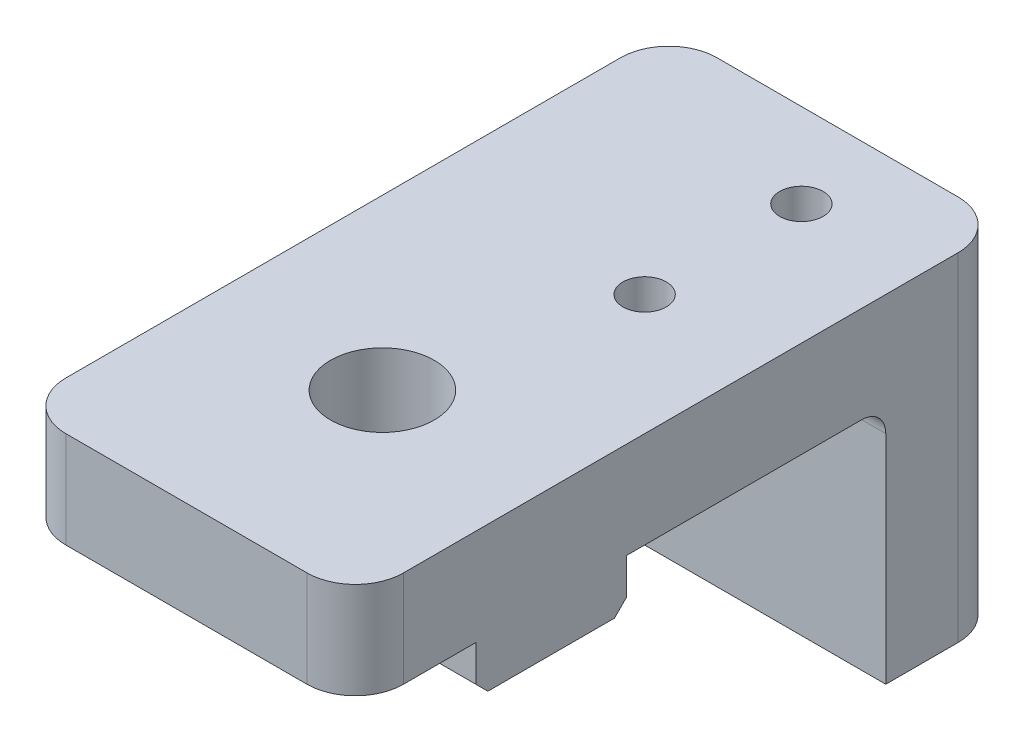
ISO-10303-21;
HEADER;
FILE_DESCRIPTION(('STEP AP214'),'2;1');
FILE_NAME('part.step','',(''),(''),'','','');
FILE_SCHEMA(('AUTOMOTIVE_DESIGN { 1 0 10303 214 1 1 1 1 }'));
ENDSEC;
DATA;
#1=APPLICATION_CONTEXT('core data for automotive mechanical design processes');
#2=APPLICATION_PROTOCOL_DEFINITION('international standard','automotive_design',2000,#1);
#3=PRODUCT_CONTEXT('',#1,'mechanical');
#4=PRODUCT('Part','Part','',(#3));
#5=PRODUCT_RELATED_PRODUCT_CATEGORY('part','',(#4));
#6=PRODUCT_DEFINITION_FORMATION('','',#4);
#7=PRODUCT_DEFINITION_CONTEXT('part definition',#1,'design');
#8=PRODUCT_DEFINITION('design','',#6,#7);
#9=PRODUCT_DEFINITION_SHAPE('','',#8);
#10=(LENGTH_UNIT() NAMED_UNIT(*) SI_UNIT(.MILLI.,.METRE.));
#11=(NAMED_UNIT(*) PLANE_ANGLE_UNIT() SI_UNIT($,.RADIAN.));
#12=(NAMED_UNIT(*) SI_UNIT($,.STERADIAN.) SOLID_ANGLE_UNIT());
#13=UNCERTAINTY_MEASURE_WITH_UNIT(LENGTH_MEASURE(1.E-05),#10,'distance_accuracy_value','');
#14=(GEOMETRIC_REPRESENTATION_CONTEXT(3) GLOBAL_UNCERTAINTY_ASSIGNED_CONTEXT((#13)) GLOBAL_UNIT_ASSIGNED_CONTEXT((#10,
#11,#12)) REPRESENTATION_CONTEXT('',''));
#15=CARTESIAN_POINT('',(0.,0.,0.));
#16=DIRECTION('',(0.,0.,1.));
#17=DIRECTION('',(1.,0.,0.));
#18=AXIS2_PLACEMENT_3D('',#15,#16,#17);
#19=CARTESIAN_POINT('',(0.,4.,-21.9999999999999));
#20=DIRECTION('',(0.,0.,1.));
#21=DIRECTION('',(1.,0.,0.));
#22=AXIS2_PLACEMENT_3D('',#19,#20,#21);
#23=PLANE('',#22);
#24=DIRECTION('',(0.,1.,0.));
#25=VECTOR('',#24,1.);
#26=CARTESIAN_POINT('',(5.25000000000001,4.,-21.9999999999999));
#27=LINE('',#26,#25);
#28=CARTESIAN_POINT('',(5.25000000000001,-0.75,-21.9999999999999));
#29=VERTEX_POINT('',#28);
#30=CARTESIAN_POINT('',(5.25000000000001,0.75,-21.9999999999999));
#31=VERTEX_POINT('',#30);
#32=EDGE_CURVE('E236',#29,#31,#27,.T.);
#33=ORIENTED_EDGE('',*,*,#32,.F.);
#34=DIRECTION('',(1.,0.,0.));
#35=VECTOR('',#34,1.);
#36=CARTESIAN_POINT('',(14.,-0.75,-21.9999999999999));
#37=LINE('',#36,#35);
#38=CARTESIAN_POINT('',(8.75000000000001,-0.75,-21.9999999999999));
#39=VERTEX_POINT('',#38);
#40=EDGE_CURVE('E219',#39,#29,#37,.F.);
#41=ORIENTED_EDGE('',*,*,#40,.F.);
#42=DIRECTION('',(0.,-1.,0.));
#43=VECTOR('',#42,1.);
#44=CARTESIAN_POINT('',(8.75000000000001,4.,-21.9999999999999));
#45=LINE('',#44,#43);
#46=CARTESIAN_POINT('',(8.75000000000001,0.75,-21.9999999999999));
#47=VERTEX_POINT('',#46);
#48=EDGE_CURVE('E230',#47,#39,#45,.T.);
#49=ORIENTED_EDGE('',*,*,#48,.F.);
#50=DIRECTION('',(1.,0.,0.));
#51=VECTOR('',#50,1.);
#52=CARTESIAN_POINT('',(14.,0.75,-21.9999999999999));
#53=LINE('',#52,#51);
#54=EDGE_CURVE('E244',#31,#47,#53,.T.);
#55=ORIENTED_EDGE('',*,*,#54,.F.);
#56=EDGE_LOOP('',(#33,#41,#49,#55));
#57=FACE_BOUND('',#56,.T.);
#58=DIRECTION('',(-1.,0.,0.));
#59=VECTOR('',#58,1.);
#60=CARTESIAN_POINT('',(0.,4.,-21.9999999999999));
#61=LINE('',#60,#59);
#62=CARTESIAN_POINT('',(12.,4.,-21.9999999999999));
#63=VERTEX_POINT('',#62);
#64=CARTESIAN_POINT('',(2.00000000000001,4.,-21.9999999999999));
#65=VERTEX_POINT('',#64);
#66=EDGE_CURVE('E366',#63,#65,#61,.T.);
#67=ORIENTED_EDGE('',*,*,#66,.F.);
#68=DIRECTION('',(0.,-1.,0.));
#69=VECTOR('',#68,1.);
#70=CARTESIAN_POINT('',(12.,4.,-21.9999999999999));
#71=LINE('',#70,#69);
#72=CARTESIAN_POINT('',(12.,-10.,-21.9999999999999));
#73=VERTEX_POINT('',#72);
#74=EDGE_CURVE('E429',#63,#73,#71,.T.);
#75=ORIENTED_EDGE('',*,*,#74,.T.);
#76=DIRECTION('',(1.,0.,0.));
#77=VECTOR('',#76,1.);
#78=CARTESIAN_POINT('',(12.,-10.,-21.9999999999999));
#79=LINE('',#78,#77);
#80=CARTESIAN_POINT('',(2.00000000000001,-10.,-21.9999999999999));
#81=VERTEX_POINT('',#80);
#82=EDGE_CURVE('E273',#81,#73,#79,.T.);
#83=ORIENTED_EDGE('',*,*,#82,.F.);
#84=DIRECTION('',(0.,-1.,0.));
#85=VECTOR('',#84,1.);
#86=CARTESIAN_POINT('',(2.00000000000001,4.,-21.9999999999999));
#87=LINE('',#86,#85);
#88=EDGE_CURVE('E427',#81,#65,#87,.F.);
#89=ORIENTED_EDGE('',*,*,#88,.T.);
#90=EDGE_LOOP('',(#67,#75,#83,#89));
#91=FACE_BOUND('',#90,.T.);
#92=CARTESIAN_POINT('',(5.25000000000001,-6.75,-21.9999999999999));
#93=VERTEX_POINT('',#92);
#94=CARTESIAN_POINT('',(5.25000000000001,-5.25,-21.9999999999999));
#95=VERTEX_POINT('',#94);
#96=EDGE_CURVE('E239',#93,#95,#27,.T.);
#97=ORIENTED_EDGE('',*,*,#96,.F.);
#98=DIRECTION('',(1.,0.,0.));
#99=VECTOR('',#98,1.);
#100=CARTESIAN_POINT('',(14.,-6.75,-21.9999999999999));
#101=LINE('',#100,#99);
#102=CARTESIAN_POINT('',(8.75000000000001,-6.75,-21.9999999999999));
#103=VERTEX_POINT('',#102);
#104=EDGE_CURVE('E251',#103,#93,#101,.F.);
#105=ORIENTED_EDGE('',*,*,#104,.F.);
#106=CARTESIAN_POINT('',(8.75000000000001,-5.25,-21.9999999999999));
#107=VERTEX_POINT('',#106);
#108=EDGE_CURVE('E247',#107,#103,#45,.T.);
#109=ORIENTED_EDGE('',*,*,#108,.F.);
#110=DIRECTION('',(1.,0.,0.));
#111=VECTOR('',#110,1.);
#112=CARTESIAN_POINT('',(14.,-5.25,-21.9999999999999));
#113=LINE('',#112,#111);
#114=EDGE_CURVE('E245',#95,#107,#113,.T.);
#115=ORIENTED_EDGE('',*,*,#114,.F.);
#116=EDGE_LOOP('',(#97,#105,#109,#115));
#117=FACE_BOUND('',#116,.T.);
#118=ADVANCED_FACE('F41',(#57,#91,#117),#23,.F.);
#119=CARTESIAN_POINT('',(0.,0.,0.));
#120=DIRECTION('',(0.,1.,0.));
#121=DIRECTION('',(0.,0.,1.));
#122=AXIS2_PLACEMENT_3D('',#119,#120,#121);
#123=PLANE('',#122);
#124=CARTESIAN_POINT('',(7.00000000000001,0.,-3.125));
#125=DIRECTION('',(0.,1.,0.));
#126=DIRECTION('',(-1.,0.,0.));
#127=AXIS2_PLACEMENT_3D('',#124,#125,#126);
#128=CIRCLE('',#127,2.15);
#129=CARTESIAN_POINT('',(4.85000000000001,0.,-3.125));
#130=VERTEX_POINT('',#129);
#131=EDGE_CURVE('E314',#130,#130,#128,.F.);
#132=ORIENTED_EDGE('',*,*,#131,.F.);
#133=EDGE_LOOP('',(#132));
#134=FACE_BOUND('',#133,.T.);
#135=CARTESIAN_POINT('',(9.00000000000001,0.,-11.9999999999999));
#136=DIRECTION('',(0.,1.,0.));
#137=DIRECTION('',(-1.,0.,0.));
#138=AXIS2_PLACEMENT_3D('',#135,#136,#137);
#139=CIRCLE('',#138,0.900000000001092);
#140=CARTESIAN_POINT('',(8.09999999999892,0.,-11.9999999999999));
#141=VERTEX_POINT('',#140);
#142=EDGE_CURVE('E318',#141,#141,#139,.T.);
#143=ORIENTED_EDGE('',*,*,#142,.T.);
#144=EDGE_LOOP('',(#143));
#145=FACE_BOUND('',#144,.T.);
#146=DIRECTION('',(0.,0.,-1.));
#147=VECTOR('',#146,1.);
#148=CARTESIAN_POINT('',(0.,0.,0.));
#149=LINE('',#148,#147);
#150=CARTESIAN_POINT('',(0.,0.,-6.25));
#151=VERTEX_POINT('',#150);
#152=CARTESIAN_POINT('',(0.,0.,-15.9999999999999));
#153=VERTEX_POINT('',#152);
#154=EDGE_CURVE('E355',#151,#153,#149,.T.);
#155=ORIENTED_EDGE('',*,*,#154,.T.);
#156=DIRECTION('',(-1.,0.,0.));
#157=VECTOR('',#156,1.);
#158=CARTESIAN_POINT('',(14.,0.,-15.9999999999999));
#159=LINE('',#158,#157);
#160=CARTESIAN_POINT('',(14.,0.,-15.9999999999999));
#161=VERTEX_POINT('',#160);
#162=EDGE_CURVE('E62',#153,#161,#159,.F.);
#163=ORIENTED_EDGE('',*,*,#162,.T.);
#164=DIRECTION('',(0.,0.,-1.));
#165=VECTOR('',#164,1.);
#166=CARTESIAN_POINT('',(14.,0.,0.));
#167=LINE('',#166,#165);
#168=CARTESIAN_POINT('',(14.,0.,-6.25));
#169=VERTEX_POINT('',#168);
#170=EDGE_CURVE('E376',#169,#161,#167,.T.);
#171=ORIENTED_EDGE('',*,*,#170,.F.);
#172=DIRECTION('',(1.,0.,0.));
#173=VECTOR('',#172,1.);
#174=CARTESIAN_POINT('',(0.,0.,-6.25));
#175=LINE('',#174,#173);
#176=CARTESIAN_POINT('',(11.5,0.,-6.25));
#177=VERTEX_POINT('',#176);
#178=EDGE_CURVE('E330',#177,#169,#175,.T.);
#179=ORIENTED_EDGE('',*,*,#178,.F.);
#180=DIRECTION('',(0.,0.,1.));
#181=VECTOR('',#180,1.);
#182=CARTESIAN_POINT('',(11.5,0.,-6.25));
#183=LINE('',#182,#181);
#184=CARTESIAN_POINT('',(11.5,0.,0.));
#185=VERTEX_POINT('',#184);
#186=EDGE_CURVE('E296',#177,#185,#183,.T.);
#187=ORIENTED_EDGE('',*,*,#186,.T.);
#188=DIRECTION('',(-1.,0.,0.));
#189=VECTOR('',#188,1.);
#190=CARTESIAN_POINT('',(0.,0.,0.));
#191=LINE('',#190,#189);
#192=CARTESIAN_POINT('',(14.,0.,0.));
#193=VERTEX_POINT('',#192);
#194=EDGE_CURVE('E335',#193,#185,#191,.T.);
#195=ORIENTED_EDGE('',*,*,#194,.F.);
#196=CARTESIAN_POINT('',(14.,0.,3.));
#197=VERTEX_POINT('',#196);
#198=EDGE_CURVE('E360',#197,#193,#167,.T.);
#199=ORIENTED_EDGE('',*,*,#198,.F.);
#200=CARTESIAN_POINT('',(12.,0.,3.));
#201=DIRECTION('',(0.,1.,0.));
#202=DIRECTION('',(-1.,0.,0.));
#203=AXIS2_PLACEMENT_3D('',#200,#201,#202);
#204=CIRCLE('',#203,2.);
#205=CARTESIAN_POINT('',(12.,0.,5.));
#206=VERTEX_POINT('',#205);
#207=EDGE_CURVE('E406',#197,#206,#204,.F.);
#208=ORIENTED_EDGE('',*,*,#207,.T.);
#209=DIRECTION('',(-1.,0.,0.));
#210=VECTOR('',#209,1.);
#211=CARTESIAN_POINT('',(0.,0.,5.));
#212=LINE('',#211,#210);
#213=CARTESIAN_POINT('',(2.,0.,5.));
#214=VERTEX_POINT('',#213);
#215=EDGE_CURVE('E373',#206,#214,#212,.T.);
#216=ORIENTED_EDGE('',*,*,#215,.T.);
#217=CARTESIAN_POINT('',(2.,0.,3.));
#218=DIRECTION('',(0.,1.,0.));
#219=DIRECTION('',(-1.,0.,0.));
#220=AXIS2_PLACEMENT_3D('',#217,#218,#219);
#221=CIRCLE('',#220,2.);
#222=CARTESIAN_POINT('',(0.,0.,3.));
#223=VERTEX_POINT('',#222);
#224=EDGE_CURVE('E408',#214,#223,#221,.F.);
#225=ORIENTED_EDGE('',*,*,#224,.T.);
#226=CARTESIAN_POINT('',(0.,0.,0.));
#227=VERTEX_POINT('',#226);
#228=EDGE_CURVE('E370',#223,#227,#149,.T.);
#229=ORIENTED_EDGE('',*,*,#228,.T.);
#230=CARTESIAN_POINT('',(2.5,0.,0.));
#231=VERTEX_POINT('',#230);
#232=EDGE_CURVE('E342',#231,#227,#191,.T.);
#233=ORIENTED_EDGE('',*,*,#232,.F.);
#234=DIRECTION('',(0.,0.,-1.));
#235=VECTOR('',#234,1.);
#236=CARTESIAN_POINT('',(2.5,0.,-6.25));
#237=LINE('',#236,#235);
#238=CARTESIAN_POINT('',(2.5,0.,-6.25));
#239=VERTEX_POINT('',#238);
#240=EDGE_CURVE('E300',#231,#239,#237,.T.);
#241=ORIENTED_EDGE('',*,*,#240,.T.);
#242=EDGE_CURVE('E339',#151,#239,#175,.T.);
#243=ORIENTED_EDGE('',*,*,#242,.F.);
#244=EDGE_LOOP('',(#155,#163,#171,#179,#187,#195,#199,#208,#216,#225,#229,#233,#241,#243));
#245=FACE_BOUND('',#244,.T.);
#246=ADVANCED_FACE('F440',(#134,#145,#245),#123,.F.);
#247=CARTESIAN_POINT('',(0.,-2.,-6.25));
#248=DIRECTION('',(0.,0.,1.));
#249=DIRECTION('',(1.,0.,0.));
#250=AXIS2_PLACEMENT_3D('',#247,#248,#249);
#251=PLANE('',#250);
#252=ORIENTED_EDGE('',*,*,#242,.T.);
#253=DIRECTION('',(0.,-1.,0.));
#254=VECTOR('',#253,1.);
#255=CARTESIAN_POINT('',(2.5,10.9573035004056,-6.25));
#256=LINE('',#255,#254);
#257=CARTESIAN_POINT('',(2.5,-1.50000000000001,-6.25));
#258=VERTEX_POINT('',#257);
#259=EDGE_CURVE('E303',#239,#258,#256,.T.);
#260=ORIENTED_EDGE('',*,*,#259,.T.);
#261=DIRECTION('',(-1.,0.,0.));
#262=VECTOR('',#261,1.);
#263=CARTESIAN_POINT('',(0.,-1.50000000000001,-6.25));
#264=LINE('',#263,#262);
#265=CARTESIAN_POINT('',(0.,-1.50000000000001,-6.25));
#266=VERTEX_POINT('',#265);
#267=EDGE_CURVE('E389',#258,#266,#264,.T.);
#268=ORIENTED_EDGE('',*,*,#267,.T.);
#269=DIRECTION('',(0.,1.,0.));
#270=VECTOR('',#269,1.);
#271=CARTESIAN_POINT('',(0.,-2.,-6.25));
#272=LINE('',#271,#270);
#273=EDGE_CURVE('E353',#266,#151,#272,.T.);
#274=ORIENTED_EDGE('',*,*,#273,.T.);
#275=EDGE_LOOP('',(#252,#260,#268,#274));
#276=FACE_BOUND('',#275,.T.);
#277=ADVANCED_FACE('F443',(#276),#251,.F.);
#278=CARTESIAN_POINT('',(0.,-2.,0.));
#279=DIRECTION('',(0.,0.,-1.));
#280=DIRECTION('',(-1.,0.,0.));
#281=AXIS2_PLACEMENT_3D('',#278,#279,#280);
#282=PLANE('',#281);
#283=DIRECTION('',(1.,0.,0.));
#284=VECTOR('',#283,1.);
#285=CARTESIAN_POINT('',(0.,-1.50000000000001,0.));
#286=LINE('',#285,#284);
#287=CARTESIAN_POINT('',(0.,-1.50000000000001,0.));
#288=VERTEX_POINT('',#287);
#289=CARTESIAN_POINT('',(2.5,-1.50000000000001,0.));
#290=VERTEX_POINT('',#289);
#291=EDGE_CURVE('E398',#288,#290,#286,.T.);
#292=ORIENTED_EDGE('',*,*,#291,.T.);
#293=DIRECTION('',(0.,-1.,0.));
#294=VECTOR('',#293,1.);
#295=CARTESIAN_POINT('',(2.5,10.9573035004056,0.));
#296=LINE('',#295,#294);
#297=EDGE_CURVE('E294',#231,#290,#296,.T.);
#298=ORIENTED_EDGE('',*,*,#297,.F.);
#299=ORIENTED_EDGE('',*,*,#232,.T.);
#300=DIRECTION('',(0.,1.,0.));
#301=VECTOR('',#300,1.);
#302=CARTESIAN_POINT('',(0.,-2.,0.));
#303=LINE('',#302,#301);
#304=EDGE_CURVE('E338',#288,#227,#303,.T.);
#305=ORIENTED_EDGE('',*,*,#304,.F.);
#306=EDGE_LOOP('',(#292,#298,#299,#305));
#307=FACE_BOUND('',#306,.T.);
#308=ADVANCED_FACE('F675',(#307),#282,.F.);
#309=CARTESIAN_POINT('',(0.,-2.,0.));
#310=DIRECTION('',(0.,1.,0.));
#311=DIRECTION('',(-1.,0.,0.));
#312=AXIS2_PLACEMENT_3D('',#309,#310,#311);
#313=PLANE('',#312);
#314=DIRECTION('',(1.,0.,0.));
#315=VECTOR('',#314,1.);
#316=CARTESIAN_POINT('',(0.,-2.,-5.75000000000001));
#317=LINE('',#316,#315);
#318=CARTESIAN_POINT('',(0.,-2.,-5.75000000000001));
#319=VERTEX_POINT('',#318);
#320=CARTESIAN_POINT('',(2.5,-2.,-5.75000000000001));
#321=VERTEX_POINT('',#320);
#322=EDGE_CURVE('E382',#319,#321,#317,.T.);
#323=ORIENTED_EDGE('',*,*,#322,.T.);
#324=DIRECTION('',(0.,0.,-1.));
#325=VECTOR('',#324,1.);
#326=CARTESIAN_POINT('',(2.5,-2.,-6.25));
#327=LINE('',#326,#325);
#328=CARTESIAN_POINT('',(2.5,-2.,-0.499999999999989));
#329=VERTEX_POINT('',#328);
#330=EDGE_CURVE('E292',#329,#321,#327,.T.);
#331=ORIENTED_EDGE('',*,*,#330,.F.);
#332=DIRECTION('',(-1.,0.,0.));
#333=VECTOR('',#332,1.);
#334=CARTESIAN_POINT('',(0.,-2.,-0.49999999999999));
#335=LINE('',#334,#333);
#336=CARTESIAN_POINT('',(0.,-2.,-0.49999999999999));
#337=VERTEX_POINT('',#336);
#338=EDGE_CURVE('E369',#329,#337,#335,.T.);
#339=ORIENTED_EDGE('',*,*,#338,.T.);
#340=DIRECTION('',(0.,0.,-1.));
#341=VECTOR('',#340,1.);
#342=CARTESIAN_POINT('',(0.,-2.,-6.25));
#343=LINE('',#342,#341);
#344=EDGE_CURVE('E331',#337,#319,#343,.T.);
#345=ORIENTED_EDGE('',*,*,#344,.T.);
#346=EDGE_LOOP('',(#323,#331,#339,#345));
#347=FACE_BOUND('',#346,.T.);
#348=ADVANCED_FACE('F685',(#347),#313,.F.);
#349=CARTESIAN_POINT('',(0.,-2.,-5.75000000000001));
#350=DIRECTION('',(0.,0.707106781186545,0.70710678118655));
#351=DIRECTION('',(1.,0.,0.));
#352=AXIS2_PLACEMENT_3D('',#349,#350,#351);
#353=PLANE('',#352);
#354=DIRECTION('',(0.,-0.70710678118655,0.707106781186545));
#355=VECTOR('',#354,1.);
#356=CARTESIAN_POINT('',(2.5,-2.,-5.75000000000001));
#357=LINE('',#356,#355);
#358=EDGE_CURVE('E312',#321,#258,#357,.F.);
#359=ORIENTED_EDGE('',*,*,#358,.F.);
#360=ORIENTED_EDGE('',*,*,#322,.F.);
#361=DIRECTION('',(0.,0.70710678118655,-0.707106781186545));
#362=VECTOR('',#361,1.);
#363=CARTESIAN_POINT('',(0.,-1.87499999999998,-5.87500000000003));
#364=LINE('',#363,#362);
#365=EDGE_CURVE('E395',#266,#319,#364,.F.);
#366=ORIENTED_EDGE('',*,*,#365,.F.);
#367=ORIENTED_EDGE('',*,*,#267,.F.);
#368=EDGE_LOOP('',(#359,#360,#366,#367));
#369=FACE_BOUND('',#368,.T.);
#370=ADVANCED_FACE('F558',(#369),#353,.F.);
#371=CARTESIAN_POINT('',(0.,-2.,-0.49999999999999));
#372=DIRECTION('',(0.,0.707106781186545,-0.70710678118655));
#373=DIRECTION('',(-1.,0.,0.));
#374=AXIS2_PLACEMENT_3D('',#371,#372,#373);
#375=PLANE('',#374);
#376=DIRECTION('',(0.,0.70710678118655,0.707106781186545));
#377=VECTOR('',#376,1.);
#378=CARTESIAN_POINT('',(2.5,-2.,-0.49999999999999));
#379=LINE('',#378,#377);
#380=EDGE_CURVE('E231',#290,#329,#379,.F.);
#381=ORIENTED_EDGE('',*,*,#380,.F.);
#382=ORIENTED_EDGE('',*,*,#291,.F.);
#383=DIRECTION('',(0.,-0.70710678118655,-0.707106781186545));
#384=VECTOR('',#383,1.);
#385=CARTESIAN_POINT('',(0.,1.25000000000002,2.75));
#386=LINE('',#385,#384);
#387=EDGE_CURVE('E393',#337,#288,#386,.F.);
#388=ORIENTED_EDGE('',*,*,#387,.F.);
#389=ORIENTED_EDGE('',*,*,#338,.F.);
#390=EDGE_LOOP('',(#381,#382,#388,#389));
#391=FACE_BOUND('',#390,.T.);
#392=ADVANCED_FACE('F550',(#391),#375,.F.);
#393=CARTESIAN_POINT('',(0.,4.,0.));
#394=DIRECTION('',(-1.,0.,0.));
#395=DIRECTION('',(0.,0.,1.));
#396=AXIS2_PLACEMENT_3D('',#393,#394,#395);
#397=PLANE('',#396);
#398=ORIENTED_EDGE('',*,*,#228,.F.);
#399=DIRECTION('',(0.,-1.,0.));
#400=VECTOR('',#399,1.);
#401=CARTESIAN_POINT('',(0.,4.,3.));
#402=LINE('',#401,#400);
#403=CARTESIAN_POINT('',(0.,4.,3.));
#404=VERTEX_POINT('',#403);
#405=EDGE_CURVE('E412',#223,#404,#402,.F.);
#406=ORIENTED_EDGE('',*,*,#405,.T.);
#407=DIRECTION('',(0.,0.,-1.));
#408=VECTOR('',#407,1.);
#409=CARTESIAN_POINT('',(0.,4.,0.));
#410=LINE('',#409,#408);
#411=CARTESIAN_POINT('',(0.,4.,-19.9999999999999));
#412=VERTEX_POINT('',#411);
#413=EDGE_CURVE('E356',#404,#412,#410,.T.);
#414=ORIENTED_EDGE('',*,*,#413,.T.);
#415=DIRECTION('',(0.,-1.,0.));
#416=VECTOR('',#415,1.);
#417=CARTESIAN_POINT('',(0.,0.,-19.9999999999999));
#418=LINE('',#417,#416);
#419=CARTESIAN_POINT('',(0.,-10.,-19.9999999999999));
#420=VERTEX_POINT('',#419);
#421=EDGE_CURVE('E410',#412,#420,#418,.T.);
#422=ORIENTED_EDGE('',*,*,#421,.T.);
#423=DIRECTION('',(0.,0.,-1.));
#424=VECTOR('',#423,1.);
#425=CARTESIAN_POINT('',(0.,-10.,-16.9999999999999));
#426=LINE('',#425,#424);
#427=CARTESIAN_POINT('',(0.,-10.,-16.9999999999999));
#428=VERTEX_POINT('',#427);
#429=EDGE_CURVE('E283',#428,#420,#426,.T.);
#430=ORIENTED_EDGE('',*,*,#429,.F.);
#431=DIRECTION('',(0.,1.,0.));
#432=VECTOR('',#431,1.);
#433=CARTESIAN_POINT('',(0.,-10.,-16.9999999999999));
#434=LINE('',#433,#432);
#435=CARTESIAN_POINT('',(0.,-0.999999999999999,-16.9999999999999));
#436=VERTEX_POINT('',#435);
#437=EDGE_CURVE('E286',#428,#436,#434,.T.);
#438=ORIENTED_EDGE('',*,*,#437,.T.);
#439=CARTESIAN_POINT('',(0.,-0.999999999999999,-15.9999999999999));
#440=DIRECTION('',(-1.,0.,0.));
#441=DIRECTION('',(0.,0.,1.));
#442=AXIS2_PLACEMENT_3D('',#439,#440,#441);
#443=CIRCLE('',#442,1.);
#444=EDGE_CURVE('E49',#436,#153,#443,.F.);
#445=ORIENTED_EDGE('',*,*,#444,.T.);
#446=ORIENTED_EDGE('',*,*,#154,.F.);
#447=ORIENTED_EDGE('',*,*,#273,.F.);
#448=ORIENTED_EDGE('',*,*,#365,.T.);
#449=ORIENTED_EDGE('',*,*,#344,.F.);
#450=ORIENTED_EDGE('',*,*,#387,.T.);
#451=ORIENTED_EDGE('',*,*,#304,.T.);
#452=EDGE_LOOP('',(#398,#406,#414,#422,#430,#438,#445,#446,#447,#448,#449,#450,#451));
#453=FACE_BOUND('',#452,.T.);
#454=ADVANCED_FACE('F484',(#453),#397,.T.);
#455=CARTESIAN_POINT('',(0.,4.,5.));
#456=DIRECTION('',(0.,0.,1.));
#457=DIRECTION('',(1.,0.,0.));
#458=AXIS2_PLACEMENT_3D('',#455,#456,#457);
#459=PLANE('',#458);
#460=DIRECTION('',(-1.,0.,0.));
#461=VECTOR('',#460,1.);
#462=CARTESIAN_POINT('',(0.,4.,5.));
#463=LINE('',#462,#461);
#464=CARTESIAN_POINT('',(12.,4.,5.));
#465=VERTEX_POINT('',#464);
#466=CARTESIAN_POINT('',(2.,4.,5.));
#467=VERTEX_POINT('',#466);
#468=EDGE_CURVE('E359',#465,#467,#463,.T.);
#469=ORIENTED_EDGE('',*,*,#468,.T.);
#470=DIRECTION('',(0.,-1.,0.));
#471=VECTOR('',#470,1.);
#472=CARTESIAN_POINT('',(2.,4.,5.));
#473=LINE('',#472,#471);
#474=EDGE_CURVE('E403',#467,#214,#473,.T.);
#475=ORIENTED_EDGE('',*,*,#474,.T.);
#476=ORIENTED_EDGE('',*,*,#215,.F.);
#477=DIRECTION('',(0.,-1.,0.));
#478=VECTOR('',#477,1.);
#479=CARTESIAN_POINT('',(12.,4.,5.));
#480=LINE('',#479,#478);
#481=EDGE_CURVE('E401',#206,#465,#480,.F.);
#482=ORIENTED_EDGE('',*,*,#481,.T.);
#483=EDGE_LOOP('',(#469,#475,#476,#482));
#484=FACE_BOUND('',#483,.T.);
#485=ADVANCED_FACE('F490',(#484),#459,.T.);
#486=CARTESIAN_POINT('',(14.,4.,0.));
#487=DIRECTION('',(-1.,0.,0.));
#488=DIRECTION('',(0.,0.,1.));
#489=AXIS2_PLACEMENT_3D('',#486,#487,#488);
#490=PLANE('',#489);
#491=DIRECTION('',(0.,0.,-1.));
#492=VECTOR('',#491,1.);
#493=CARTESIAN_POINT('',(14.,4.,0.));
#494=LINE('',#493,#492);
#495=CARTESIAN_POINT('',(14.,4.,3.));
#496=VERTEX_POINT('',#495);
#497=CARTESIAN_POINT('',(14.,4.,-19.9999999999999));
#498=VERTEX_POINT('',#497);
#499=EDGE_CURVE('E363',#496,#498,#494,.T.);
#500=ORIENTED_EDGE('',*,*,#499,.F.);
#501=DIRECTION('',(0.,-1.,0.));
#502=VECTOR('',#501,1.);
#503=CARTESIAN_POINT('',(14.,0.,3.));
#504=LINE('',#503,#502);
#505=EDGE_CURVE('E424',#496,#197,#504,.T.);
#506=ORIENTED_EDGE('',*,*,#505,.T.);
#507=ORIENTED_EDGE('',*,*,#198,.T.);
#508=DIRECTION('',(0.,1.,0.));
#509=VECTOR('',#508,1.);
#510=CARTESIAN_POINT('',(14.,-2.,0.));
#511=LINE('',#510,#509);
#512=CARTESIAN_POINT('',(14.,-1.50000000000001,0.));
#513=VERTEX_POINT('',#512);
#514=EDGE_CURVE('E347',#513,#193,#511,.T.);
#515=ORIENTED_EDGE('',*,*,#514,.F.);
#516=DIRECTION('',(0.,0.70710678118655,0.707106781186545));
#517=VECTOR('',#516,1.);
#518=CARTESIAN_POINT('',(14.,-2.,-0.499999999999991));
#519=LINE('',#518,#517);
#520=CARTESIAN_POINT('',(14.,-2.,-0.499999999999988));
#521=VERTEX_POINT('',#520);
#522=EDGE_CURVE('E385',#513,#521,#519,.F.);
#523=ORIENTED_EDGE('',*,*,#522,.T.);
#524=DIRECTION('',(0.,0.,1.));
#525=VECTOR('',#524,1.);
#526=CARTESIAN_POINT('',(14.,-2.,-6.25));
#527=LINE('',#526,#525);
#528=CARTESIAN_POINT('',(14.,-2.,-5.75000000000001));
#529=VERTEX_POINT('',#528);
#530=EDGE_CURVE('E334',#529,#521,#527,.T.);
#531=ORIENTED_EDGE('',*,*,#530,.F.);
#532=DIRECTION('',(0.,-0.70710678118655,0.707106781186545));
#533=VECTOR('',#532,1.);
#534=CARTESIAN_POINT('',(14.,-2.,-5.75000000000001));
#535=LINE('',#534,#533);
#536=CARTESIAN_POINT('',(14.,-1.50000000000001,-6.25));
#537=VERTEX_POINT('',#536);
#538=EDGE_CURVE('E387',#529,#537,#535,.F.);
#539=ORIENTED_EDGE('',*,*,#538,.T.);
#540=DIRECTION('',(0.,1.,0.));
#541=VECTOR('',#540,1.);
#542=CARTESIAN_POINT('',(14.,-2.,-6.25));
#543=LINE('',#542,#541);
#544=EDGE_CURVE('E350',#537,#169,#543,.T.);
#545=ORIENTED_EDGE('',*,*,#544,.T.);
#546=ORIENTED_EDGE('',*,*,#170,.T.);
#547=CARTESIAN_POINT('',(14.,-0.999999999999999,-15.9999999999999));
#548=DIRECTION('',(-1.,0.,0.));
#549=DIRECTION('',(0.,0.,1.));
#550=AXIS2_PLACEMENT_3D('',#547,#548,#549);
#551=CIRCLE('',#550,1.);
#552=CARTESIAN_POINT('',(14.,-0.999999999999999,-16.9999999999999));
#553=VERTEX_POINT('',#552);
#554=EDGE_CURVE('E11',#161,#553,#551,.T.);
#555=ORIENTED_EDGE('',*,*,#554,.T.);
#556=DIRECTION('',(0.,1.,0.));
#557=VECTOR('',#556,1.);
#558=CARTESIAN_POINT('',(14.,-10.,-16.9999999999999));
#559=LINE('',#558,#557);
#560=CARTESIAN_POINT('',(14.,-10.,-16.9999999999999));
#561=VERTEX_POINT('',#560);
#562=EDGE_CURVE('E288',#561,#553,#559,.T.);
#563=ORIENTED_EDGE('',*,*,#562,.F.);
#564=DIRECTION('',(0.,0.,1.));
#565=VECTOR('',#564,1.);
#566=CARTESIAN_POINT('',(14.,-10.,-16.9999999999999));
#567=LINE('',#566,#565);
#568=CARTESIAN_POINT('',(14.,-10.,-19.9999999999999));
#569=VERTEX_POINT('',#568);
#570=EDGE_CURVE('E279',#569,#561,#567,.T.);
#571=ORIENTED_EDGE('',*,*,#570,.F.);
#572=DIRECTION('',(0.,-1.,0.));
#573=VECTOR('',#572,1.);
#574=CARTESIAN_POINT('',(14.,4.,-19.9999999999999));
#575=LINE('',#574,#573);
#576=EDGE_CURVE('E422',#569,#498,#575,.F.);
#577=ORIENTED_EDGE('',*,*,#576,.T.);
#578=EDGE_LOOP('',(#500,#506,#507,#515,#523,#531,#539,#545,#546,#555,#563,#571,#577));
#579=FACE_BOUND('',#578,.T.);
#580=ADVANCED_FACE('F454',(#579),#490,.F.);
#581=CARTESIAN_POINT('',(0.,4.,0.));
#582=DIRECTION('',(0.,1.,0.));
#583=DIRECTION('',(0.,0.,1.));
#584=AXIS2_PLACEMENT_3D('',#581,#582,#583);
#585=PLANE('',#584);
#586=CARTESIAN_POINT('',(9.00000000000001,4.,-18.4999999999999));
#587=DIRECTION('',(0.,1.,0.));
#588=DIRECTION('',(-1.,0.,0.));
#589=AXIS2_PLACEMENT_3D('',#586,#587,#588);
#590=CIRCLE('',#589,0.900000000001093);
#591=CARTESIAN_POINT('',(8.09999999999892,4.,-18.4999999999999));
#592=VERTEX_POINT('',#591);
#593=EDGE_CURVE('E315',#592,#592,#590,.T.);
#594=ORIENTED_EDGE('',*,*,#593,.F.);
#595=EDGE_LOOP('',(#594));
#596=FACE_BOUND('',#595,.T.);
#597=CARTESIAN_POINT('',(9.00000000000001,4.,-11.9999999999999));
#598=DIRECTION('',(0.,1.,0.));
#599=DIRECTION('',(-1.,0.,0.));
#600=AXIS2_PLACEMENT_3D('',#597,#598,#599);
#601=CIRCLE('',#600,0.900000000001092);
#602=CARTESIAN_POINT('',(8.09999999999892,4.,-11.9999999999999));
#603=VERTEX_POINT('',#602);
#604=EDGE_CURVE('E319',#603,#603,#601,.T.);
#605=ORIENTED_EDGE('',*,*,#604,.F.);
#606=EDGE_LOOP('',(#605));
#607=FACE_BOUND('',#606,.T.);
#608=CARTESIAN_POINT('',(7.00000000000001,4.,-3.125));
#609=DIRECTION('',(0.,1.,0.));
#610=DIRECTION('',(-1.,0.,0.));
#611=AXIS2_PLACEMENT_3D('',#608,#609,#610);
#612=CIRCLE('',#611,2.15);
#613=CARTESIAN_POINT('',(4.85000000000001,4.,-3.125));
#614=VERTEX_POINT('',#613);
#615=EDGE_CURVE('E322',#614,#614,#612,.T.);
#616=ORIENTED_EDGE('',*,*,#615,.F.);
#617=EDGE_LOOP('',(#616));
#618=FACE_BOUND('',#617,.T.);
#619=ORIENTED_EDGE('',*,*,#413,.F.);
#620=CARTESIAN_POINT('',(2.,4.,3.));
#621=DIRECTION('',(0.,1.,0.));
#622=DIRECTION('',(-1.,0.,0.));
#623=AXIS2_PLACEMENT_3D('',#620,#621,#622);
#624=CIRCLE('',#623,2.);
#625=EDGE_CURVE('E420',#404,#467,#624,.T.);
#626=ORIENTED_EDGE('',*,*,#625,.T.);
#627=ORIENTED_EDGE('',*,*,#468,.F.);
#628=CARTESIAN_POINT('',(12.,4.,3.));
#629=DIRECTION('',(0.,1.,0.));
#630=DIRECTION('',(-1.,0.,0.));
#631=AXIS2_PLACEMENT_3D('',#628,#629,#630);
#632=CIRCLE('',#631,2.);
#633=EDGE_CURVE('E418',#465,#496,#632,.T.);
#634=ORIENTED_EDGE('',*,*,#633,.T.);
#635=ORIENTED_EDGE('',*,*,#499,.T.);
#636=CARTESIAN_POINT('',(12.,4.,-19.9999999999999));
#637=DIRECTION('',(0.,1.,0.));
#638=DIRECTION('',(-1.,0.,0.));
#639=AXIS2_PLACEMENT_3D('',#636,#637,#638);
#640=CIRCLE('',#639,2.);
#641=EDGE_CURVE('E416',#498,#63,#640,.T.);
#642=ORIENTED_EDGE('',*,*,#641,.T.);
#643=ORIENTED_EDGE('',*,*,#66,.T.);
#644=CARTESIAN_POINT('',(2.00000000000001,4.,-19.9999999999999));
#645=DIRECTION('',(0.,1.,0.));
#646=DIRECTION('',(-1.,0.,0.));
#647=AXIS2_PLACEMENT_3D('',#644,#645,#646);
#648=CIRCLE('',#647,2.);
#649=EDGE_CURVE('E414',#65,#412,#648,.T.);
#650=ORIENTED_EDGE('',*,*,#649,.T.);
#651=EDGE_LOOP('',(#619,#626,#627,#634,#635,#642,#643,#650));
#652=FACE_BOUND('',#651,.T.);
#653=ADVANCED_FACE('F470',(#596,#607,#618,#652),#585,.T.);
#654=CARTESIAN_POINT('',(11.5,-1.50000000000001,-6.25));
#655=VERTEX_POINT('',#654);
#656=EDGE_CURVE('E390',#537,#655,#264,.T.);
#657=ORIENTED_EDGE('',*,*,#656,.T.);
#658=DIRECTION('',(0.,-1.,0.));
#659=VECTOR('',#658,1.);
#660=CARTESIAN_POINT('',(11.5,10.9573035004056,-6.25));
#661=LINE('',#660,#659);
#662=EDGE_CURVE('E299',#177,#655,#661,.T.);
#663=ORIENTED_EDGE('',*,*,#662,.F.);
#664=ORIENTED_EDGE('',*,*,#178,.T.);
#665=ORIENTED_EDGE('',*,*,#544,.F.);
#666=EDGE_LOOP('',(#657,#663,#664,#665));
#667=FACE_BOUND('',#666,.T.);
#668=ADVANCED_FACE('F518',(#667),#251,.F.);
#669=ORIENTED_EDGE('',*,*,#194,.T.);
#670=DIRECTION('',(0.,-1.,0.));
#671=VECTOR('',#670,1.);
#672=CARTESIAN_POINT('',(11.5,10.9573035004056,0.));
#673=LINE('',#672,#671);
#674=CARTESIAN_POINT('',(11.5,-1.50000000000001,0.));
#675=VERTEX_POINT('',#674);
#676=EDGE_CURVE('E298',#185,#675,#673,.T.);
#677=ORIENTED_EDGE('',*,*,#676,.T.);
#678=EDGE_CURVE('E397',#675,#513,#286,.T.);
#679=ORIENTED_EDGE('',*,*,#678,.T.);
#680=ORIENTED_EDGE('',*,*,#514,.T.);
#681=EDGE_LOOP('',(#669,#677,#679,#680));
#682=FACE_BOUND('',#681,.T.);
#683=ADVANCED_FACE('F501',(#682),#282,.F.);
#684=CARTESIAN_POINT('',(11.5,-2.,-0.499999999999989));
#685=VERTEX_POINT('',#684);
#686=EDGE_CURVE('E378',#521,#685,#335,.T.);
#687=ORIENTED_EDGE('',*,*,#686,.T.);
#688=DIRECTION('',(0.,0.,1.));
#689=VECTOR('',#688,1.);
#690=CARTESIAN_POINT('',(11.5,-2.,-6.25));
#691=LINE('',#690,#689);
#692=CARTESIAN_POINT('',(11.5,-2.,-5.75000000000001));
#693=VERTEX_POINT('',#692);
#694=EDGE_CURVE('E291',#693,#685,#691,.T.);
#695=ORIENTED_EDGE('',*,*,#694,.F.);
#696=EDGE_CURVE('E381',#693,#529,#317,.T.);
#697=ORIENTED_EDGE('',*,*,#696,.T.);
#698=ORIENTED_EDGE('',*,*,#530,.T.);
#699=EDGE_LOOP('',(#687,#695,#697,#698));
#700=FACE_BOUND('',#699,.T.);
#701=ADVANCED_FACE('F511',(#700),#313,.F.);
#702=CARTESIAN_POINT('',(7.00000000000001,-2.,-3.125));
#703=DIRECTION('',(0.,1.,0.));
#704=DIRECTION('',(-1.,0.,0.));
#705=AXIS2_PLACEMENT_3D('',#702,#703,#704);
#706=CYLINDRICAL_SURFACE('',#705,2.15);
#707=ORIENTED_EDGE('',*,*,#131,.T.);
#708=EDGE_LOOP('',(#707));
#709=FACE_BOUND('',#708,.T.);
#710=ORIENTED_EDGE('',*,*,#615,.T.);
#711=EDGE_LOOP('',(#710));
#712=FACE_BOUND('',#711,.T.);
#713=ADVANCED_FACE('F437',(#709,#712),#706,.F.);
#714=CARTESIAN_POINT('',(9.00000000000001,-2.,-11.9999999999999));
#715=DIRECTION('',(0.,1.,0.));
#716=DIRECTION('',(-1.,0.,0.));
#717=AXIS2_PLACEMENT_3D('',#714,#715,#716);
#718=CYLINDRICAL_SURFACE('',#717,0.900000000001092);
#719=ORIENTED_EDGE('',*,*,#604,.T.);
#720=EDGE_LOOP('',(#719));
#721=FACE_BOUND('',#720,.T.);
#722=ORIENTED_EDGE('',*,*,#142,.F.);
#723=EDGE_LOOP('',(#722));
#724=FACE_BOUND('',#723,.T.);
#725=ADVANCED_FACE('F750',(#721,#724),#718,.F.);
#726=CARTESIAN_POINT('',(9.00000000000001,-2.,-18.4999999999999));
#727=DIRECTION('',(0.,1.,0.));
#728=DIRECTION('',(-1.,0.,0.));
#729=AXIS2_PLACEMENT_3D('',#726,#727,#728);
#730=CYLINDRICAL_SURFACE('',#729,0.900000000001093);
#731=ORIENTED_EDGE('',*,*,#593,.T.);
#732=EDGE_LOOP('',(#731));
#733=FACE_BOUND('',#732,.T.);
#734=CARTESIAN_POINT('',(9.00000000000001,0.,-18.4999999999999));
#735=DIRECTION('',(0.,1.,0.));
#736=DIRECTION('',(-1.,0.,0.));
#737=AXIS2_PLACEMENT_3D('',#734,#735,#736);
#738=CIRCLE('',#737,0.900000000001093);
#739=CARTESIAN_POINT('',(8.09999999999892,0.,-18.4999999999999));
#740=VERTEX_POINT('',#739);
#741=EDGE_CURVE('E327',#740,#740,#738,.T.);
#742=ORIENTED_EDGE('',*,*,#741,.F.);
#743=EDGE_LOOP('',(#742));
#744=FACE_BOUND('',#743,.T.);
#745=ADVANCED_FACE('F557',(#733,#744),#730,.F.);
#746=DIRECTION('',(0.,0.70710678118655,-0.707106781186545));
#747=VECTOR('',#746,1.);
#748=CARTESIAN_POINT('',(11.5,-2.,-5.75000000000001));
#749=LINE('',#748,#747);
#750=EDGE_CURVE('E310',#655,#693,#749,.F.);
#751=ORIENTED_EDGE('',*,*,#750,.F.);
#752=ORIENTED_EDGE('',*,*,#656,.F.);
#753=ORIENTED_EDGE('',*,*,#538,.F.);
#754=ORIENTED_EDGE('',*,*,#696,.F.);
#755=EDGE_LOOP('',(#751,#752,#753,#754));
#756=FACE_BOUND('',#755,.T.);
#757=ADVANCED_FACE('F521',(#756),#353,.F.);
#758=DIRECTION('',(0.,-0.70710678118655,-0.707106781186545));
#759=VECTOR('',#758,1.);
#760=CARTESIAN_POINT('',(11.5,-2.,-0.499999999999989));
#761=LINE('',#760,#759);
#762=EDGE_CURVE('E431',#685,#675,#761,.F.);
#763=ORIENTED_EDGE('',*,*,#762,.F.);
#764=ORIENTED_EDGE('',*,*,#686,.F.);
#765=ORIENTED_EDGE('',*,*,#522,.F.);
#766=ORIENTED_EDGE('',*,*,#678,.F.);
#767=EDGE_LOOP('',(#763,#764,#765,#766));
#768=FACE_BOUND('',#767,.T.);
#769=ADVANCED_FACE('F508',(#768),#375,.F.);
#770=CARTESIAN_POINT('',(2.,4.,3.));
#771=DIRECTION('',(0.,-1.,0.));
#772=DIRECTION('',(0.,0.,-1.));
#773=AXIS2_PLACEMENT_3D('',#770,#771,#772);
#774=CYLINDRICAL_SURFACE('',#773,2.);
#775=ORIENTED_EDGE('',*,*,#625,.F.);
#776=ORIENTED_EDGE('',*,*,#405,.F.);
#777=ORIENTED_EDGE('',*,*,#224,.F.);
#778=ORIENTED_EDGE('',*,*,#474,.F.);
#779=EDGE_LOOP('',(#775,#776,#777,#778));
#780=FACE_BOUND('',#779,.T.);
#781=ADVANCED_FACE('F487',(#780),#774,.T.);
#782=CARTESIAN_POINT('',(12.,4.,3.));
#783=DIRECTION('',(0.,1.,0.));
#784=DIRECTION('',(0.,0.,1.));
#785=AXIS2_PLACEMENT_3D('',#782,#783,#784);
#786=CYLINDRICAL_SURFACE('',#785,2.);
#787=ORIENTED_EDGE('',*,*,#633,.F.);
#788=ORIENTED_EDGE('',*,*,#481,.F.);
#789=ORIENTED_EDGE('',*,*,#207,.F.);
#790=ORIENTED_EDGE('',*,*,#505,.F.);
#791=EDGE_LOOP('',(#787,#788,#789,#790));
#792=FACE_BOUND('',#791,.T.);
#793=ADVANCED_FACE('F494',(#792),#786,.T.);
#794=CARTESIAN_POINT('',(12.,4.,-19.9999999999999));
#795=DIRECTION('',(0.,-1.,0.));
#796=DIRECTION('',(0.,0.,-1.));
#797=AXIS2_PLACEMENT_3D('',#794,#795,#796);
#798=CYLINDRICAL_SURFACE('',#797,2.);
#799=ORIENTED_EDGE('',*,*,#641,.F.);
#800=ORIENTED_EDGE('',*,*,#576,.F.);
#801=CARTESIAN_POINT('',(12.,-10.,-19.9999999999999));
#802=DIRECTION('',(0.,-1.,0.));
#803=DIRECTION('',(1.,0.,0.));
#804=AXIS2_PLACEMENT_3D('',#801,#802,#803);
#805=CIRCLE('',#804,2.);
#806=EDGE_CURVE('E276',#73,#569,#805,.T.);
#807=ORIENTED_EDGE('',*,*,#806,.F.);
#808=ORIENTED_EDGE('',*,*,#74,.F.);
#809=EDGE_LOOP('',(#799,#800,#807,#808));
#810=FACE_BOUND('',#809,.T.);
#811=ADVANCED_FACE('F475',(#810),#798,.T.);
#812=CARTESIAN_POINT('',(2.00000000000001,4.,-19.9999999999999));
#813=DIRECTION('',(0.,1.,0.));
#814=DIRECTION('',(0.,0.,1.));
#815=AXIS2_PLACEMENT_3D('',#812,#813,#814);
#816=CYLINDRICAL_SURFACE('',#815,2.);
#817=ORIENTED_EDGE('',*,*,#649,.F.);
#818=ORIENTED_EDGE('',*,*,#88,.F.);
#819=CARTESIAN_POINT('',(2.00000000000001,-10.,-19.9999999999999));
#820=DIRECTION('',(0.,-1.,0.));
#821=DIRECTION('',(1.,0.,0.));
#822=AXIS2_PLACEMENT_3D('',#819,#820,#821);
#823=CIRCLE('',#822,2.);
#824=EDGE_CURVE('E267',#420,#81,#823,.T.);
#825=ORIENTED_EDGE('',*,*,#824,.F.);
#826=ORIENTED_EDGE('',*,*,#421,.F.);
#827=EDGE_LOOP('',(#817,#818,#825,#826));
#828=FACE_BOUND('',#827,.T.);
#829=ADVANCED_FACE('F481',(#828),#816,.T.);
#830=CARTESIAN_POINT('',(2.5,10.9573035004056,-6.25));
#831=DIRECTION('',(-1.,0.,0.));
#832=DIRECTION('',(0.,-1.,0.));
#833=AXIS2_PLACEMENT_3D('',#830,#831,#832);
#834=PLANE('',#833);
#835=ORIENTED_EDGE('',*,*,#358,.T.);
#836=ORIENTED_EDGE('',*,*,#259,.F.);
#837=ORIENTED_EDGE('',*,*,#240,.F.);
#838=ORIENTED_EDGE('',*,*,#297,.T.);
#839=ORIENTED_EDGE('',*,*,#380,.T.);
#840=ORIENTED_EDGE('',*,*,#330,.T.);
#841=EDGE_LOOP('',(#835,#836,#837,#838,#839,#840));
#842=FACE_BOUND('',#841,.T.);
#843=ADVANCED_FACE('F525',(#842),#834,.F.);
#844=CARTESIAN_POINT('',(11.5,10.9573035004056,-6.25));
#845=DIRECTION('',(1.,0.,0.));
#846=DIRECTION('',(0.,1.,0.));
#847=AXIS2_PLACEMENT_3D('',#844,#845,#846);
#848=PLANE('',#847);
#849=ORIENTED_EDGE('',*,*,#750,.T.);
#850=ORIENTED_EDGE('',*,*,#694,.T.);
#851=ORIENTED_EDGE('',*,*,#762,.T.);
#852=ORIENTED_EDGE('',*,*,#676,.F.);
#853=ORIENTED_EDGE('',*,*,#186,.F.);
#854=ORIENTED_EDGE('',*,*,#662,.T.);
#855=EDGE_LOOP('',(#849,#850,#851,#852,#853,#854));
#856=FACE_BOUND('',#855,.T.);
#857=ADVANCED_FACE('F523',(#856),#848,.F.);
#858=CARTESIAN_POINT('',(2.00000000000001,-10.,-19.9999999999999));
#859=DIRECTION('',(0.,-1.,0.));
#860=DIRECTION('',(1.,0.,0.));
#861=AXIS2_PLACEMENT_3D('',#858,#859,#860);
#862=PLANE('',#861);
#863=ORIENTED_EDGE('',*,*,#824,.T.);
#864=ORIENTED_EDGE('',*,*,#82,.T.);
#865=ORIENTED_EDGE('',*,*,#806,.T.);
#866=ORIENTED_EDGE('',*,*,#570,.T.);
#867=DIRECTION('',(-1.,0.,0.));
#868=VECTOR('',#867,1.);
#869=CARTESIAN_POINT('',(0.,-10.,-16.9999999999999));
#870=LINE('',#869,#868);
#871=EDGE_CURVE('E281',#561,#428,#870,.T.);
#872=ORIENTED_EDGE('',*,*,#871,.T.);
#873=ORIENTED_EDGE('',*,*,#429,.T.);
#874=EDGE_LOOP('',(#863,#864,#865,#866,#872,#873));
#875=FACE_BOUND('',#874,.T.);
#876=ADVANCED_FACE('F462',(#875),#862,.T.);
#877=CARTESIAN_POINT('',(0.,-10.,-16.9999999999999));
#878=DIRECTION('',(0.,0.,-1.));
#879=DIRECTION('',(-1.,0.,0.));
#880=AXIS2_PLACEMENT_3D('',#877,#878,#879);
#881=PLANE('',#880);
#882=ORIENTED_EDGE('',*,*,#562,.T.);
#883=DIRECTION('',(-1.,0.,0.));
#884=VECTOR('',#883,1.);
#885=CARTESIAN_POINT('',(0.,-0.999999999999999,-16.9999999999999));
#886=LINE('',#885,#884);
#887=EDGE_CURVE('E250',#553,#436,#886,.T.);
#888=ORIENTED_EDGE('',*,*,#887,.T.);
#889=ORIENTED_EDGE('',*,*,#437,.F.);
#890=ORIENTED_EDGE('',*,*,#871,.F.);
#891=EDGE_LOOP('',(#882,#888,#889,#890));
#892=FACE_BOUND('',#891,.T.);
#893=ADVANCED_FACE('F458',(#892),#881,.F.);
#894=CARTESIAN_POINT('',(2.00000000000001,0.,-19.9999999999999));
#895=DIRECTION('',(0.,-1.,0.));
#896=DIRECTION('',(1.,0.,0.));
#897=AXIS2_PLACEMENT_3D('',#894,#895,#896);
#898=PLANE('',#897);
#899=ORIENTED_EDGE('',*,*,#741,.T.);
#900=EDGE_LOOP('',(#899));
#901=FACE_BOUND('',#900,.T.);
#902=ADVANCED_FACE('F581',(#901),#898,.F.);
#903=CARTESIAN_POINT('',(5.25000000000001,0.75,-21.9999999999999));
#904=DIRECTION('',(1.,0.,0.));
#905=DIRECTION('',(0.,0.,-1.));
#906=AXIS2_PLACEMENT_3D('',#903,#904,#905);
#907=PLANE('',#906);
#908=ORIENTED_EDGE('',*,*,#96,.T.);
#909=CARTESIAN_POINT('',(5.25000000000001,-3.,-21.9999999999999));
#910=DIRECTION('',(1.,0.,0.));
#911=DIRECTION('',(0.,0.,-1.));
#912=AXIS2_PLACEMENT_3D('',#909,#910,#911);
#913=CIRCLE('',#912,2.25);
#914=EDGE_CURVE('E222',#29,#95,#913,.T.);
#915=ORIENTED_EDGE('',*,*,#914,.F.);
#916=ORIENTED_EDGE('',*,*,#32,.T.);
#917=CARTESIAN_POINT('',(5.25000000000001,-3.,-21.9999999999999));
#918=DIRECTION('',(1.,0.,0.));
#919=DIRECTION('',(0.,0.,-1.));
#920=AXIS2_PLACEMENT_3D('',#917,#918,#919);
#921=CIRCLE('',#920,3.75);
#922=EDGE_CURVE('E265',#31,#93,#921,.T.);
#923=ORIENTED_EDGE('',*,*,#922,.T.);
#924=EDGE_LOOP('',(#908,#915,#916,#923));
#925=FACE_BOUND('',#924,.T.);
#926=ADVANCED_FACE('F234',(#925),#907,.T.);
#927=CARTESIAN_POINT('',(14.,-3.,-21.9999999999999));
#928=DIRECTION('',(1.,0.,0.));
#929=DIRECTION('',(0.,0.,-1.));
#930=AXIS2_PLACEMENT_3D('',#927,#928,#929);
#931=CYLINDRICAL_SURFACE('',#930,3.75);
#932=ORIENTED_EDGE('',*,*,#104,.T.);
#933=ORIENTED_EDGE('',*,*,#922,.F.);
#934=ORIENTED_EDGE('',*,*,#54,.T.);
#935=CARTESIAN_POINT('',(8.75000000000001,-3.,-21.9999999999999));
#936=DIRECTION('',(1.,0.,0.));
#937=DIRECTION('',(0.,0.,-1.));
#938=AXIS2_PLACEMENT_3D('',#935,#936,#937);
#939=CIRCLE('',#938,3.75);
#940=EDGE_CURVE('E264',#47,#103,#939,.T.);
#941=ORIENTED_EDGE('',*,*,#940,.T.);
#942=EDGE_LOOP('',(#932,#933,#934,#941));
#943=FACE_BOUND('',#942,.T.);
#944=ADVANCED_FACE('F606',(#943),#931,.F.);
#945=CARTESIAN_POINT('',(8.75000000000001,0.75,-21.9999999999999));
#946=DIRECTION('',(-1.,0.,0.));
#947=DIRECTION('',(0.,0.,1.));
#948=AXIS2_PLACEMENT_3D('',#945,#946,#947);
#949=PLANE('',#948);
#950=ORIENTED_EDGE('',*,*,#48,.T.);
#951=CARTESIAN_POINT('',(8.75000000000001,-3.,-21.9999999999999));
#952=DIRECTION('',(1.,0.,0.));
#953=DIRECTION('',(0.,0.,-1.));
#954=AXIS2_PLACEMENT_3D('',#951,#952,#953);
#955=CIRCLE('',#954,2.25);
#956=EDGE_CURVE('E225',#39,#107,#955,.T.);
#957=ORIENTED_EDGE('',*,*,#956,.T.);
#958=ORIENTED_EDGE('',*,*,#108,.T.);
#959=ORIENTED_EDGE('',*,*,#940,.F.);
#960=EDGE_LOOP('',(#950,#957,#958,#959));
#961=FACE_BOUND('',#960,.T.);
#962=ADVANCED_FACE('F263',(#961),#949,.T.);
#963=CARTESIAN_POINT('',(14.,-3.,-21.9999999999999));
#964=DIRECTION('',(1.,0.,0.));
#965=DIRECTION('',(0.,0.,-1.));
#966=AXIS2_PLACEMENT_3D('',#963,#964,#965);
#967=CYLINDRICAL_SURFACE('',#966,2.25);
#968=ORIENTED_EDGE('',*,*,#114,.T.);
#969=ORIENTED_EDGE('',*,*,#956,.F.);
#970=ORIENTED_EDGE('',*,*,#40,.T.);
#971=ORIENTED_EDGE('',*,*,#914,.T.);
#972=EDGE_LOOP('',(#968,#969,#970,#971));
#973=FACE_BOUND('',#972,.T.);
#974=ADVANCED_FACE('F221',(#973),#967,.T.);
#975=CARTESIAN_POINT('',(0.,-0.999999999999999,-15.9999999999999));
#976=DIRECTION('',(1.,0.,0.));
#977=DIRECTION('',(0.,0.,-1.));
#978=AXIS2_PLACEMENT_3D('',#975,#976,#977);
#979=CYLINDRICAL_SURFACE('',#978,1.);
#980=ORIENTED_EDGE('',*,*,#554,.F.);
#981=ORIENTED_EDGE('',*,*,#162,.F.);
#982=ORIENTED_EDGE('',*,*,#444,.F.);
#983=ORIENTED_EDGE('',*,*,#887,.F.);
#984=EDGE_LOOP('',(#980,#981,#982,#983));
#985=FACE_BOUND('',#984,.T.);
#986=ADVANCED_FACE('F43',(#985),#979,.F.);
#987=CLOSED_SHELL('',(#118,#246,#277,#308,#348,#370,#392,#454,#485,#580,#653,#668,#683,#701,
#713,#725,#745,#757,#769,#781,#793,#811,#829,#843,#857,#876,#893,#902,#926,#944,#962,#974,#986));
#988=MANIFOLD_SOLID_BREP('B2',#987);
#989=ADVANCED_BREP_SHAPE_REPRESENTATION('',(#18,#988),#14);
#990=SHAPE_DEFINITION_REPRESENTATION(#9,#989);
ENDSEC;
END-ISO-10303-21;
